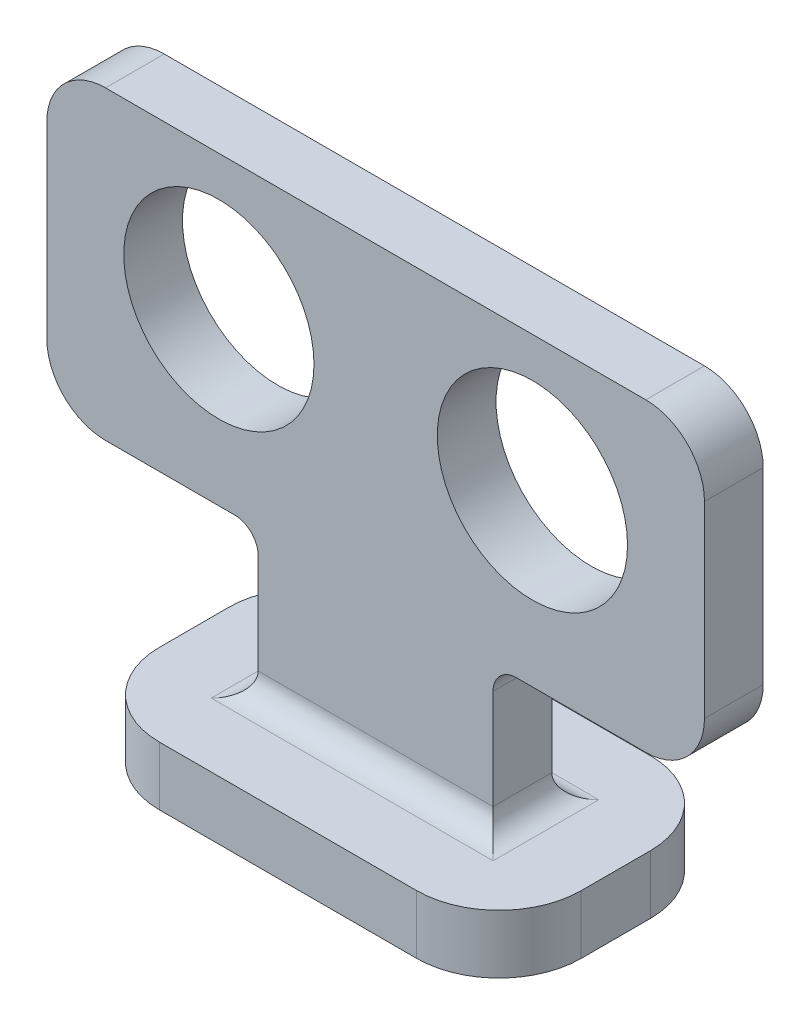
ISO-10303-21;
HEADER;
FILE_DESCRIPTION(('STEP AP214'),'2;1');
FILE_NAME('part.step','',(''),(''),'','','');
FILE_SCHEMA(('AUTOMOTIVE_DESIGN { 1 0 10303 214 1 1 1 1 }'));
ENDSEC;
DATA;
#1=APPLICATION_CONTEXT('core data for automotive mechanical design processes');
#2=APPLICATION_PROTOCOL_DEFINITION('international standard','automotive_design',2000,#1);
#3=PRODUCT_CONTEXT('',#1,'mechanical');
#4=PRODUCT('Part','Part','',(#3));
#5=PRODUCT_RELATED_PRODUCT_CATEGORY('part','',(#4));
#6=PRODUCT_DEFINITION_FORMATION('','',#4);
#7=PRODUCT_DEFINITION_CONTEXT('part definition',#1,'design');
#8=PRODUCT_DEFINITION('design','',#6,#7);
#9=PRODUCT_DEFINITION_SHAPE('','',#8);
#10=(LENGTH_UNIT() NAMED_UNIT(*) SI_UNIT(.MILLI.,.METRE.));
#11=(NAMED_UNIT(*) PLANE_ANGLE_UNIT() SI_UNIT($,.RADIAN.));
#12=(NAMED_UNIT(*) SI_UNIT($,.STERADIAN.) SOLID_ANGLE_UNIT());
#13=UNCERTAINTY_MEASURE_WITH_UNIT(LENGTH_MEASURE(1.E-05),#10,'distance_accuracy_value','');
#14=(GEOMETRIC_REPRESENTATION_CONTEXT(3) GLOBAL_UNCERTAINTY_ASSIGNED_CONTEXT((#13)) GLOBAL_UNIT_ASSIGNED_CONTEXT((#10,
#11,#12)) REPRESENTATION_CONTEXT('',''));
#15=CARTESIAN_POINT('',(0.,0.,0.));
#16=DIRECTION('',(0.,0.,1.));
#17=DIRECTION('',(1.,0.,0.));
#18=AXIS2_PLACEMENT_3D('',#15,#16,#17);
#19=CARTESIAN_POINT('',(-3.,-3.,5.));
#20=DIRECTION('',(0.,1.,0.));
#21=DIRECTION('',(0.,0.,1.));
#22=AXIS2_PLACEMENT_3D('',#19,#20,#21);
#23=PLANE('',#22);
#24=DIRECTION('',(1.,0.,0.));
#25=VECTOR('',#24,1.);
#26=CARTESIAN_POINT('',(-3.,-3.,5.));
#27=LINE('',#26,#25);
#28=CARTESIAN_POINT('',(37.,-3.,5.));
#29=VERTEX_POINT('',#28);
#30=CARTESIAN_POINT('',(48.,-3.,5.));
#31=VERTEX_POINT('',#30);
#32=EDGE_CURVE('E509',#29,#31,#27,.T.);
#33=ORIENTED_EDGE('',*,*,#32,.F.);
#34=DIRECTION('',(0.,0.,1.));
#35=VECTOR('',#34,1.);
#36=CARTESIAN_POINT('',(37.,-3.,0.));
#37=LINE('',#36,#35);
#38=CARTESIAN_POINT('',(37.,-3.,0.));
#39=VERTEX_POINT('',#38);
#40=EDGE_CURVE('E321',#29,#39,#37,.F.);
#41=ORIENTED_EDGE('',*,*,#40,.T.);
#42=DIRECTION('',(1.,0.,0.));
#43=VECTOR('',#42,1.);
#44=CARTESIAN_POINT('',(-3.,-3.,0.));
#45=LINE('',#44,#43);
#46=CARTESIAN_POINT('',(48.,-3.,0.));
#47=VERTEX_POINT('',#46);
#48=EDGE_CURVE('E480',#39,#47,#45,.T.);
#49=ORIENTED_EDGE('',*,*,#48,.T.);
#50=DIRECTION('',(0.,0.,-1.));
#51=VECTOR('',#50,1.);
#52=CARTESIAN_POINT('',(48.,-3.,5.));
#53=LINE('',#52,#51);
#54=EDGE_CURVE('E285',#47,#31,#53,.F.);
#55=ORIENTED_EDGE('',*,*,#54,.T.);
#56=EDGE_LOOP('',(#33,#41,#49,#55));
#57=FACE_BOUND('',#56,.T.);
#58=ADVANCED_FACE('F69',(#57),#23,.F.);
#59=CARTESIAN_POINT('',(2.,-3.,0.));
#60=VERTEX_POINT('',#59);
#61=CARTESIAN_POINT('',(13.,-3.,0.));
#62=VERTEX_POINT('',#61);
#63=EDGE_CURVE('E276',#60,#62,#45,.T.);
#64=ORIENTED_EDGE('',*,*,#63,.T.);
#65=DIRECTION('',(0.,0.,-1.));
#66=VECTOR('',#65,1.);
#67=CARTESIAN_POINT('',(13.,-3.,5.));
#68=LINE('',#67,#66);
#69=CARTESIAN_POINT('',(13.,-3.,5.));
#70=VERTEX_POINT('',#69);
#71=EDGE_CURVE('E328',#62,#70,#68,.F.);
#72=ORIENTED_EDGE('',*,*,#71,.T.);
#73=CARTESIAN_POINT('',(2.,-3.,5.));
#74=VERTEX_POINT('',#73);
#75=EDGE_CURVE('E498',#74,#70,#27,.T.);
#76=ORIENTED_EDGE('',*,*,#75,.F.);
#77=DIRECTION('',(0.,0.,-1.));
#78=VECTOR('',#77,1.);
#79=CARTESIAN_POINT('',(2.,-3.,5.));
#80=LINE('',#79,#78);
#81=EDGE_CURVE('E313',#74,#60,#80,.T.);
#82=ORIENTED_EDGE('',*,*,#81,.T.);
#83=EDGE_LOOP('',(#64,#72,#76,#82));
#84=FACE_BOUND('',#83,.T.);
#85=ADVANCED_FACE('F549',(#84),#23,.F.);
#86=CARTESIAN_POINT('',(0.,23.,5.));
#87=DIRECTION('',(0.,1.,0.));
#88=DIRECTION('',(-1.,0.,0.));
#89=AXIS2_PLACEMENT_3D('',#86,#87,#88);
#90=PLANE('',#89);
#91=DIRECTION('',(1.,0.,0.));
#92=VECTOR('',#91,1.);
#93=CARTESIAN_POINT('',(0.,23.,5.));
#94=LINE('',#93,#92);
#95=CARTESIAN_POINT('',(2.,23.,5.));
#96=VERTEX_POINT('',#95);
#97=CARTESIAN_POINT('',(48.,23.,5.));
#98=VERTEX_POINT('',#97);
#99=EDGE_CURVE('E481',#96,#98,#94,.T.);
#100=ORIENTED_EDGE('',*,*,#99,.T.);
#101=DIRECTION('',(0.,0.,-1.));
#102=VECTOR('',#101,1.);
#103=CARTESIAN_POINT('',(48.,23.,5.));
#104=LINE('',#103,#102);
#105=CARTESIAN_POINT('',(48.,23.,0.));
#106=VERTEX_POINT('',#105);
#107=EDGE_CURVE('E303',#98,#106,#104,.T.);
#108=ORIENTED_EDGE('',*,*,#107,.T.);
#109=DIRECTION('',(1.,0.,0.));
#110=VECTOR('',#109,1.);
#111=CARTESIAN_POINT('',(0.,23.,0.));
#112=LINE('',#111,#110);
#113=CARTESIAN_POINT('',(2.,23.,0.));
#114=VERTEX_POINT('',#113);
#115=EDGE_CURVE('E241',#114,#106,#112,.T.);
#116=ORIENTED_EDGE('',*,*,#115,.F.);
#117=DIRECTION('',(0.,0.,-1.));
#118=VECTOR('',#117,1.);
#119=CARTESIAN_POINT('',(2.,23.,5.));
#120=LINE('',#119,#118);
#121=EDGE_CURVE('E300',#114,#96,#120,.F.);
#122=ORIENTED_EDGE('',*,*,#121,.T.);
#123=EDGE_LOOP('',(#100,#108,#116,#122));
#124=FACE_BOUND('',#123,.T.);
#125=ADVANCED_FACE('F535',(#124),#90,.T.);
#126=CARTESIAN_POINT('',(-3.,0.,5.));
#127=DIRECTION('',(1.,0.,0.));
#128=DIRECTION('',(0.,0.,-1.));
#129=AXIS2_PLACEMENT_3D('',#126,#127,#128);
#130=PLANE('',#129);
#131=DIRECTION('',(0.,-1.,0.));
#132=VECTOR('',#131,1.);
#133=CARTESIAN_POINT('',(-3.,0.,5.));
#134=LINE('',#133,#132);
#135=CARTESIAN_POINT('',(-3.,18.,5.));
#136=VERTEX_POINT('',#135);
#137=CARTESIAN_POINT('',(-3.,2.,5.));
#138=VERTEX_POINT('',#137);
#139=EDGE_CURVE('E485',#136,#138,#134,.T.);
#140=ORIENTED_EDGE('',*,*,#139,.F.);
#141=DIRECTION('',(0.,0.,-1.));
#142=VECTOR('',#141,1.);
#143=CARTESIAN_POINT('',(-3.,18.,0.));
#144=LINE('',#143,#142);
#145=CARTESIAN_POINT('',(-3.,18.,0.));
#146=VERTEX_POINT('',#145);
#147=EDGE_CURVE('E309',#136,#146,#144,.T.);
#148=ORIENTED_EDGE('',*,*,#147,.T.);
#149=DIRECTION('',(0.,-1.,0.));
#150=VECTOR('',#149,1.);
#151=CARTESIAN_POINT('',(-3.,0.,0.));
#152=LINE('',#151,#150);
#153=CARTESIAN_POINT('',(-3.,2.,0.));
#154=VERTEX_POINT('',#153);
#155=EDGE_CURVE('E260',#146,#154,#152,.T.);
#156=ORIENTED_EDGE('',*,*,#155,.T.);
#157=DIRECTION('',(0.,0.,-1.));
#158=VECTOR('',#157,1.);
#159=CARTESIAN_POINT('',(-3.,2.,5.));
#160=LINE('',#159,#158);
#161=EDGE_CURVE('E306',#154,#138,#160,.F.);
#162=ORIENTED_EDGE('',*,*,#161,.T.);
#163=EDGE_LOOP('',(#140,#148,#156,#162));
#164=FACE_BOUND('',#163,.T.);
#165=ADVANCED_FACE('F543',(#164),#130,.F.);
#166=CARTESIAN_POINT('',(11.65,11.5,5.));
#167=DIRECTION('',(0.,0.,-1.));
#168=DIRECTION('',(-1.,0.,0.));
#169=AXIS2_PLACEMENT_3D('',#166,#167,#168);
#170=CYLINDRICAL_SURFACE('',#169,8.1);
#171=CARTESIAN_POINT('',(11.65,11.5,5.));
#172=DIRECTION('',(0.,0.,1.));
#173=DIRECTION('',(1.,0.,0.));
#174=AXIS2_PLACEMENT_3D('',#171,#172,#173);
#175=CIRCLE('',#174,8.1);
#176=CARTESIAN_POINT('',(19.75,11.5,5.));
#177=VERTEX_POINT('',#176);
#178=EDGE_CURVE('E273',#177,#177,#175,.T.);
#179=ORIENTED_EDGE('',*,*,#178,.T.);
#180=EDGE_LOOP('',(#179));
#181=FACE_BOUND('',#180,.T.);
#182=CARTESIAN_POINT('',(11.65,11.5,0.));
#183=DIRECTION('',(0.,0.,1.));
#184=DIRECTION('',(1.,0.,0.));
#185=AXIS2_PLACEMENT_3D('',#182,#183,#184);
#186=CIRCLE('',#185,8.1);
#187=CARTESIAN_POINT('',(19.75,11.5,0.));
#188=VERTEX_POINT('',#187);
#189=EDGE_CURVE('E259',#188,#188,#186,.T.);
#190=ORIENTED_EDGE('',*,*,#189,.F.);
#191=EDGE_LOOP('',(#190));
#192=FACE_BOUND('',#191,.T.);
#193=ADVANCED_FACE('F857',(#181,#192),#170,.F.);
#194=CARTESIAN_POINT('',(53.,0.,5.));
#195=DIRECTION('',(1.,0.,0.));
#196=DIRECTION('',(0.,0.,-1.));
#197=AXIS2_PLACEMENT_3D('',#194,#195,#196);
#198=PLANE('',#197);
#199=DIRECTION('',(0.,-1.,0.));
#200=VECTOR('',#199,1.);
#201=CARTESIAN_POINT('',(53.,0.,5.));
#202=LINE('',#201,#200);
#203=CARTESIAN_POINT('',(53.,18.,5.));
#204=VERTEX_POINT('',#203);
#205=CARTESIAN_POINT('',(53.,2.,5.));
#206=VERTEX_POINT('',#205);
#207=EDGE_CURVE('E490',#204,#206,#202,.T.);
#208=ORIENTED_EDGE('',*,*,#207,.T.);
#209=DIRECTION('',(0.,0.,-1.));
#210=VECTOR('',#209,1.);
#211=CARTESIAN_POINT('',(53.,2.,0.));
#212=LINE('',#211,#210);
#213=CARTESIAN_POINT('',(53.,2.,0.));
#214=VERTEX_POINT('',#213);
#215=EDGE_CURVE('E257',#206,#214,#212,.T.);
#216=ORIENTED_EDGE('',*,*,#215,.T.);
#217=DIRECTION('',(0.,-1.,0.));
#218=VECTOR('',#217,1.);
#219=CARTESIAN_POINT('',(53.,0.,0.));
#220=LINE('',#219,#218);
#221=CARTESIAN_POINT('',(53.,18.,0.));
#222=VERTEX_POINT('',#221);
#223=EDGE_CURVE('E239',#222,#214,#220,.T.);
#224=ORIENTED_EDGE('',*,*,#223,.F.);
#225=DIRECTION('',(0.,0.,-1.));
#226=VECTOR('',#225,1.);
#227=CARTESIAN_POINT('',(53.,18.,5.));
#228=LINE('',#227,#226);
#229=EDGE_CURVE('E254',#222,#204,#228,.F.);
#230=ORIENTED_EDGE('',*,*,#229,.T.);
#231=EDGE_LOOP('',(#208,#216,#224,#230));
#232=FACE_BOUND('',#231,.T.);
#233=ADVANCED_FACE('F253',(#232),#198,.T.);
#234=CARTESIAN_POINT('',(38.35,11.5,5.));
#235=DIRECTION('',(0.,0.,-1.));
#236=DIRECTION('',(-1.,0.,0.));
#237=AXIS2_PLACEMENT_3D('',#234,#235,#236);
#238=CYLINDRICAL_SURFACE('',#237,8.1);
#239=CARTESIAN_POINT('',(38.35,11.5,5.));
#240=DIRECTION('',(0.,0.,1.));
#241=DIRECTION('',(1.,0.,0.));
#242=AXIS2_PLACEMENT_3D('',#239,#240,#241);
#243=CIRCLE('',#242,8.1);
#244=CARTESIAN_POINT('',(46.45,11.5,5.));
#245=VERTEX_POINT('',#244);
#246=EDGE_CURVE('E266',#245,#245,#243,.T.);
#247=ORIENTED_EDGE('',*,*,#246,.T.);
#248=EDGE_LOOP('',(#247));
#249=FACE_BOUND('',#248,.T.);
#250=CARTESIAN_POINT('',(38.35,11.5,0.));
#251=DIRECTION('',(0.,0.,1.));
#252=DIRECTION('',(1.,0.,0.));
#253=AXIS2_PLACEMENT_3D('',#250,#251,#252);
#254=CIRCLE('',#253,8.1);
#255=CARTESIAN_POINT('',(46.45,11.5,0.));
#256=VERTEX_POINT('',#255);
#257=EDGE_CURVE('E486',#256,#256,#254,.T.);
#258=ORIENTED_EDGE('',*,*,#257,.F.);
#259=EDGE_LOOP('',(#258));
#260=FACE_BOUND('',#259,.T.);
#261=ADVANCED_FACE('F651',(#249,#260),#238,.F.);
#262=CARTESIAN_POINT('',(0.,0.,5.));
#263=DIRECTION('',(0.,0.,1.));
#264=DIRECTION('',(1.,0.,0.));
#265=AXIS2_PLACEMENT_3D('',#262,#263,#264);
#266=PLANE('',#265);
#267=DIRECTION('',(0.,1.,0.));
#268=VECTOR('',#267,1.);
#269=CARTESIAN_POINT('',(15.,-15.5,5.));
#270=LINE('',#269,#268);
#271=CARTESIAN_POINT('',(15.,-13.5,5.));
#272=VERTEX_POINT('',#271);
#273=CARTESIAN_POINT('',(15.,-5.,5.));
#274=VERTEX_POINT('',#273);
#275=EDGE_CURVE('E474',#272,#274,#270,.T.);
#276=ORIENTED_EDGE('',*,*,#275,.F.);
#277=DIRECTION('',(-1.,0.,0.));
#278=VECTOR('',#277,1.);
#279=CARTESIAN_POINT('',(35.,-13.5,5.));
#280=LINE('',#279,#278);
#281=CARTESIAN_POINT('',(35.,-13.5,5.));
#282=VERTEX_POINT('',#281);
#283=EDGE_CURVE('E362',#272,#282,#280,.F.);
#284=ORIENTED_EDGE('',*,*,#283,.T.);
#285=DIRECTION('',(0.,1.,0.));
#286=VECTOR('',#285,1.);
#287=CARTESIAN_POINT('',(35.,-15.5,5.));
#288=LINE('',#287,#286);
#289=CARTESIAN_POINT('',(35.,-5.,5.));
#290=VERTEX_POINT('',#289);
#291=EDGE_CURVE('E477',#282,#290,#288,.T.);
#292=ORIENTED_EDGE('',*,*,#291,.T.);
#293=CARTESIAN_POINT('',(37.,-5.,5.));
#294=DIRECTION('',(0.,0.,1.));
#295=DIRECTION('',(1.,0.,0.));
#296=AXIS2_PLACEMENT_3D('',#293,#294,#295);
#297=CIRCLE('',#296,2.);
#298=EDGE_CURVE('E331',#290,#29,#297,.F.);
#299=ORIENTED_EDGE('',*,*,#298,.T.);
#300=ORIENTED_EDGE('',*,*,#32,.T.);
#301=CARTESIAN_POINT('',(48.,2.,5.));
#302=DIRECTION('',(0.,0.,1.));
#303=DIRECTION('',(1.,0.,0.));
#304=AXIS2_PLACEMENT_3D('',#301,#302,#303);
#305=CIRCLE('',#304,5.);
#306=EDGE_CURVE('E297',#31,#206,#305,.T.);
#307=ORIENTED_EDGE('',*,*,#306,.T.);
#308=ORIENTED_EDGE('',*,*,#207,.F.);
#309=CARTESIAN_POINT('',(48.,18.,5.));
#310=DIRECTION('',(0.,0.,1.));
#311=DIRECTION('',(1.,0.,0.));
#312=AXIS2_PLACEMENT_3D('',#309,#310,#311);
#313=CIRCLE('',#312,5.);
#314=EDGE_CURVE('E264',#204,#98,#313,.T.);
#315=ORIENTED_EDGE('',*,*,#314,.T.);
#316=ORIENTED_EDGE('',*,*,#99,.F.);
#317=CARTESIAN_POINT('',(2.,18.,5.));
#318=DIRECTION('',(0.,0.,1.));
#319=DIRECTION('',(1.,0.,0.));
#320=AXIS2_PLACEMENT_3D('',#317,#318,#319);
#321=CIRCLE('',#320,5.);
#322=EDGE_CURVE('E292',#96,#136,#321,.T.);
#323=ORIENTED_EDGE('',*,*,#322,.T.);
#324=ORIENTED_EDGE('',*,*,#139,.T.);
#325=CARTESIAN_POINT('',(2.,2.,5.));
#326=DIRECTION('',(0.,0.,1.));
#327=DIRECTION('',(1.,0.,0.));
#328=AXIS2_PLACEMENT_3D('',#325,#326,#327);
#329=CIRCLE('',#328,5.);
#330=EDGE_CURVE('E289',#138,#74,#329,.T.);
#331=ORIENTED_EDGE('',*,*,#330,.T.);
#332=ORIENTED_EDGE('',*,*,#75,.T.);
#333=CARTESIAN_POINT('',(13.,-5.,5.));
#334=DIRECTION('',(0.,0.,1.));
#335=DIRECTION('',(1.,0.,0.));
#336=AXIS2_PLACEMENT_3D('',#333,#334,#335);
#337=CIRCLE('',#336,2.);
#338=EDGE_CURVE('E341',#70,#274,#337,.F.);
#339=ORIENTED_EDGE('',*,*,#338,.T.);
#340=EDGE_LOOP('',(#276,#284,#292,#299,#300,#307,#308,#315,#316,#323,#324,#331,#332,#339));
#341=FACE_BOUND('',#340,.T.);
#342=ORIENTED_EDGE('',*,*,#178,.F.);
#343=EDGE_LOOP('',(#342));
#344=FACE_BOUND('',#343,.T.);
#345=ORIENTED_EDGE('',*,*,#246,.F.);
#346=EDGE_LOOP('',(#345));
#347=FACE_BOUND('',#346,.T.);
#348=ADVANCED_FACE('F530',(#341,#344,#347),#266,.T.);
#349=CARTESIAN_POINT('',(0.,0.,0.));
#350=DIRECTION('',(0.,0.,1.));
#351=DIRECTION('',(1.,0.,0.));
#352=AXIS2_PLACEMENT_3D('',#349,#350,#351);
#353=PLANE('',#352);
#354=DIRECTION('',(0.,1.,0.));
#355=VECTOR('',#354,1.);
#356=CARTESIAN_POINT('',(35.,-15.5,0.));
#357=LINE('',#356,#355);
#358=CARTESIAN_POINT('',(35.,-13.5,0.));
#359=VERTEX_POINT('',#358);
#360=CARTESIAN_POINT('',(35.,-5.,0.));
#361=VERTEX_POINT('',#360);
#362=EDGE_CURVE('E467',#359,#361,#357,.T.);
#363=ORIENTED_EDGE('',*,*,#362,.F.);
#364=DIRECTION('',(1.,0.,0.));
#365=VECTOR('',#364,1.);
#366=CARTESIAN_POINT('',(0.,-13.5,0.));
#367=LINE('',#366,#365);
#368=CARTESIAN_POINT('',(15.,-13.5,0.));
#369=VERTEX_POINT('',#368);
#370=EDGE_CURVE('E368',#359,#369,#367,.F.);
#371=ORIENTED_EDGE('',*,*,#370,.T.);
#372=DIRECTION('',(0.,1.,0.));
#373=VECTOR('',#372,1.);
#374=CARTESIAN_POINT('',(15.,-15.5,0.));
#375=LINE('',#374,#373);
#376=CARTESIAN_POINT('',(15.,-5.,0.));
#377=VERTEX_POINT('',#376);
#378=EDGE_CURVE('E470',#369,#377,#375,.T.);
#379=ORIENTED_EDGE('',*,*,#378,.T.);
#380=CARTESIAN_POINT('',(13.,-5.,0.));
#381=DIRECTION('',(0.,0.,1.));
#382=DIRECTION('',(1.,0.,0.));
#383=AXIS2_PLACEMENT_3D('',#380,#381,#382);
#384=CIRCLE('',#383,2.);
#385=EDGE_CURVE('E338',#377,#62,#384,.T.);
#386=ORIENTED_EDGE('',*,*,#385,.T.);
#387=ORIENTED_EDGE('',*,*,#63,.F.);
#388=CARTESIAN_POINT('',(2.,2.,0.));
#389=DIRECTION('',(0.,0.,1.));
#390=DIRECTION('',(1.,0.,0.));
#391=AXIS2_PLACEMENT_3D('',#388,#389,#390);
#392=CIRCLE('',#391,5.);
#393=EDGE_CURVE('E270',#60,#154,#392,.F.);
#394=ORIENTED_EDGE('',*,*,#393,.T.);
#395=ORIENTED_EDGE('',*,*,#155,.F.);
#396=CARTESIAN_POINT('',(2.,18.,0.));
#397=DIRECTION('',(0.,0.,1.));
#398=DIRECTION('',(1.,0.,0.));
#399=AXIS2_PLACEMENT_3D('',#396,#397,#398);
#400=CIRCLE('',#399,5.);
#401=EDGE_CURVE('E248',#146,#114,#400,.F.);
#402=ORIENTED_EDGE('',*,*,#401,.T.);
#403=ORIENTED_EDGE('',*,*,#115,.T.);
#404=CARTESIAN_POINT('',(48.,18.,0.));
#405=DIRECTION('',(0.,0.,1.));
#406=DIRECTION('',(1.,0.,0.));
#407=AXIS2_PLACEMENT_3D('',#404,#405,#406);
#408=CIRCLE('',#407,5.);
#409=EDGE_CURVE('E233',#106,#222,#408,.F.);
#410=ORIENTED_EDGE('',*,*,#409,.T.);
#411=ORIENTED_EDGE('',*,*,#223,.T.);
#412=CARTESIAN_POINT('',(48.,2.,0.));
#413=DIRECTION('',(0.,0.,1.));
#414=DIRECTION('',(1.,0.,0.));
#415=AXIS2_PLACEMENT_3D('',#412,#413,#414);
#416=CIRCLE('',#415,5.);
#417=EDGE_CURVE('E247',#214,#47,#416,.F.);
#418=ORIENTED_EDGE('',*,*,#417,.T.);
#419=ORIENTED_EDGE('',*,*,#48,.F.);
#420=CARTESIAN_POINT('',(37.,-5.,0.));
#421=DIRECTION('',(0.,0.,1.));
#422=DIRECTION('',(1.,0.,0.));
#423=AXIS2_PLACEMENT_3D('',#420,#421,#422);
#424=CIRCLE('',#423,2.);
#425=EDGE_CURVE('E334',#39,#361,#424,.T.);
#426=ORIENTED_EDGE('',*,*,#425,.T.);
#427=EDGE_LOOP('',(#363,#371,#379,#386,#387,#394,#395,#402,#403,#410,#411,#418,#419,#426));
#428=FACE_BOUND('',#427,.T.);
#429=ORIENTED_EDGE('',*,*,#189,.T.);
#430=EDGE_LOOP('',(#429));
#431=FACE_BOUND('',#430,.T.);
#432=ORIENTED_EDGE('',*,*,#257,.T.);
#433=EDGE_LOOP('',(#432));
#434=FACE_BOUND('',#433,.T.);
#435=ADVANCED_FACE('F236',(#428,#431,#434),#353,.F.);
#436=CARTESIAN_POINT('',(35.,-15.5,0.));
#437=DIRECTION('',(-1.,0.,0.));
#438=DIRECTION('',(0.,0.,1.));
#439=AXIS2_PLACEMENT_3D('',#436,#437,#438);
#440=PLANE('',#439);
#441=ORIENTED_EDGE('',*,*,#291,.F.);
#442=DIRECTION('',(0.,0.,1.));
#443=VECTOR('',#442,1.);
#444=CARTESIAN_POINT('',(35.,-13.5,0.));
#445=LINE('',#444,#443);
#446=EDGE_CURVE('E365',#282,#359,#445,.F.);
#447=ORIENTED_EDGE('',*,*,#446,.T.);
#448=ORIENTED_EDGE('',*,*,#362,.T.);
#449=DIRECTION('',(0.,0.,1.));
#450=VECTOR('',#449,1.);
#451=CARTESIAN_POINT('',(35.,-5.,5.));
#452=LINE('',#451,#450);
#453=EDGE_CURVE('E317',#361,#290,#452,.T.);
#454=ORIENTED_EDGE('',*,*,#453,.T.);
#455=EDGE_LOOP('',(#441,#447,#448,#454));
#456=FACE_BOUND('',#455,.T.);
#457=ADVANCED_FACE('F580',(#456),#440,.F.);
#458=CARTESIAN_POINT('',(15.,-15.5,0.));
#459=DIRECTION('',(1.,0.,0.));
#460=DIRECTION('',(0.,0.,-1.));
#461=AXIS2_PLACEMENT_3D('',#458,#459,#460);
#462=PLANE('',#461);
#463=ORIENTED_EDGE('',*,*,#378,.F.);
#464=DIRECTION('',(0.,0.,-1.));
#465=VECTOR('',#464,1.);
#466=CARTESIAN_POINT('',(15.,-13.5,0.));
#467=LINE('',#466,#465);
#468=EDGE_CURVE('E358',#369,#272,#467,.F.);
#469=ORIENTED_EDGE('',*,*,#468,.T.);
#470=ORIENTED_EDGE('',*,*,#275,.T.);
#471=DIRECTION('',(0.,0.,-1.));
#472=VECTOR('',#471,1.);
#473=CARTESIAN_POINT('',(15.,-5.,0.));
#474=LINE('',#473,#472);
#475=EDGE_CURVE('E324',#274,#377,#474,.T.);
#476=ORIENTED_EDGE('',*,*,#475,.T.);
#477=EDGE_LOOP('',(#463,#469,#470,#476));
#478=FACE_BOUND('',#477,.T.);
#479=ADVANCED_FACE('F558',(#478),#462,.F.);
#480=CARTESIAN_POINT('',(42.95,-20.5,-7.45));
#481=DIRECTION('',(-1.,0.,0.));
#482=DIRECTION('',(0.,0.,1.));
#483=AXIS2_PLACEMENT_3D('',#480,#481,#482);
#484=PLANE('',#483);
#485=DIRECTION('',(0.,0.,1.));
#486=VECTOR('',#485,1.);
#487=CARTESIAN_POINT('',(42.95,-20.5,-7.45));
#488=LINE('',#487,#486);
#489=CARTESIAN_POINT('',(42.95,-20.5,-0.449999999999999));
#490=VERTEX_POINT('',#489);
#491=CARTESIAN_POINT('',(42.95,-20.5,5.45));
#492=VERTEX_POINT('',#491);
#493=EDGE_CURVE('E434',#490,#492,#488,.T.);
#494=ORIENTED_EDGE('',*,*,#493,.F.);
#495=DIRECTION('',(0.,1.,0.));
#496=VECTOR('',#495,1.);
#497=CARTESIAN_POINT('',(42.95,-20.5,-0.449999999999997));
#498=LINE('',#497,#496);
#499=CARTESIAN_POINT('',(42.95,-15.5,-0.449999999999999));
#500=VERTEX_POINT('',#499);
#501=EDGE_CURVE('E12',#490,#500,#498,.T.);
#502=ORIENTED_EDGE('',*,*,#501,.T.);
#503=DIRECTION('',(0.,0.,1.));
#504=VECTOR('',#503,1.);
#505=CARTESIAN_POINT('',(42.95,-15.5,-7.45));
#506=LINE('',#505,#504);
#507=CARTESIAN_POINT('',(42.95,-15.5,5.45));
#508=VERTEX_POINT('',#507);
#509=EDGE_CURVE('E386',#500,#508,#506,.T.);
#510=ORIENTED_EDGE('',*,*,#509,.T.);
#511=DIRECTION('',(0.,1.,0.));
#512=VECTOR('',#511,1.);
#513=CARTESIAN_POINT('',(42.95,-20.5,5.45));
#514=LINE('',#513,#512);
#515=EDGE_CURVE('E78',#508,#492,#514,.F.);
#516=ORIENTED_EDGE('',*,*,#515,.T.);
#517=EDGE_LOOP('',(#494,#502,#510,#516));
#518=FACE_BOUND('',#517,.T.);
#519=ADVANCED_FACE('F433',(#518),#484,.F.);
#520=CARTESIAN_POINT('',(7.05,-20.5,12.45));
#521=DIRECTION('',(0.,0.,-1.));
#522=DIRECTION('',(-1.,0.,0.));
#523=AXIS2_PLACEMENT_3D('',#520,#521,#522);
#524=PLANE('',#523);
#525=DIRECTION('',(-1.,0.,0.));
#526=VECTOR('',#525,1.);
#527=CARTESIAN_POINT('',(7.05,-15.5,12.45));
#528=LINE('',#527,#526);
#529=CARTESIAN_POINT('',(35.95,-15.5,12.45));
#530=VERTEX_POINT('',#529);
#531=CARTESIAN_POINT('',(14.05,-15.5,12.45));
#532=VERTEX_POINT('',#531);
#533=EDGE_CURVE('E449',#530,#532,#528,.T.);
#534=ORIENTED_EDGE('',*,*,#533,.T.);
#535=DIRECTION('',(0.,1.,0.));
#536=VECTOR('',#535,1.);
#537=CARTESIAN_POINT('',(14.05,-20.5,12.45));
#538=LINE('',#537,#536);
#539=CARTESIAN_POINT('',(14.05,-20.5,12.45));
#540=VERTEX_POINT('',#539);
#541=EDGE_CURVE('E85',#532,#540,#538,.F.);
#542=ORIENTED_EDGE('',*,*,#541,.T.);
#543=DIRECTION('',(-1.,0.,0.));
#544=VECTOR('',#543,1.);
#545=CARTESIAN_POINT('',(7.05,-20.5,12.45));
#546=LINE('',#545,#544);
#547=CARTESIAN_POINT('',(35.95,-20.5,12.45));
#548=VERTEX_POINT('',#547);
#549=EDGE_CURVE('E443',#548,#540,#546,.T.);
#550=ORIENTED_EDGE('',*,*,#549,.F.);
#551=DIRECTION('',(0.,1.,0.));
#552=VECTOR('',#551,1.);
#553=CARTESIAN_POINT('',(35.95,-20.5,12.45));
#554=LINE('',#553,#552);
#555=EDGE_CURVE('E423',#548,#530,#554,.T.);
#556=ORIENTED_EDGE('',*,*,#555,.T.);
#557=EDGE_LOOP('',(#534,#542,#550,#556));
#558=FACE_BOUND('',#557,.T.);
#559=ADVANCED_FACE('F448',(#558),#524,.F.);
#560=CARTESIAN_POINT('',(7.05,-20.5,-7.45));
#561=DIRECTION('',(1.,0.,0.));
#562=DIRECTION('',(0.,0.,-1.));
#563=AXIS2_PLACEMENT_3D('',#560,#561,#562);
#564=PLANE('',#563);
#565=DIRECTION('',(0.,0.,-1.));
#566=VECTOR('',#565,1.);
#567=CARTESIAN_POINT('',(7.05,-15.5,-7.45));
#568=LINE('',#567,#566);
#569=CARTESIAN_POINT('',(7.05,-15.5,5.45));
#570=VERTEX_POINT('',#569);
#571=CARTESIAN_POINT('',(7.05,-15.5,-0.449999999999999));
#572=VERTEX_POINT('',#571);
#573=EDGE_CURVE('E455',#570,#572,#568,.T.);
#574=ORIENTED_EDGE('',*,*,#573,.T.);
#575=DIRECTION('',(0.,1.,0.));
#576=VECTOR('',#575,1.);
#577=CARTESIAN_POINT('',(7.05,-20.5,-0.449999999999997));
#578=LINE('',#577,#576);
#579=CARTESIAN_POINT('',(7.05,-20.5,-0.449999999999999));
#580=VERTEX_POINT('',#579);
#581=EDGE_CURVE('E409',#572,#580,#578,.F.);
#582=ORIENTED_EDGE('',*,*,#581,.T.);
#583=DIRECTION('',(0.,0.,-1.));
#584=VECTOR('',#583,1.);
#585=CARTESIAN_POINT('',(7.05,-20.5,-7.45));
#586=LINE('',#585,#584);
#587=CARTESIAN_POINT('',(7.05,-20.5,5.45));
#588=VERTEX_POINT('',#587);
#589=EDGE_CURVE('E957',#588,#580,#586,.T.);
#590=ORIENTED_EDGE('',*,*,#589,.F.);
#591=DIRECTION('',(0.,1.,0.));
#592=VECTOR('',#591,1.);
#593=CARTESIAN_POINT('',(7.05,-20.5,5.45));
#594=LINE('',#593,#592);
#595=EDGE_CURVE('E405',#588,#570,#594,.T.);
#596=ORIENTED_EDGE('',*,*,#595,.T.);
#597=EDGE_LOOP('',(#574,#582,#590,#596));
#598=FACE_BOUND('',#597,.T.);
#599=ADVANCED_FACE('F734',(#598),#564,.F.);
#600=CARTESIAN_POINT('',(7.05,-20.5,-7.45));
#601=DIRECTION('',(0.,0.,1.));
#602=DIRECTION('',(1.,0.,0.));
#603=AXIS2_PLACEMENT_3D('',#600,#601,#602);
#604=PLANE('',#603);
#605=DIRECTION('',(1.,0.,0.));
#606=VECTOR('',#605,1.);
#607=CARTESIAN_POINT('',(7.05,-20.5,-7.45));
#608=LINE('',#607,#606);
#609=CARTESIAN_POINT('',(14.05,-20.5,-7.45));
#610=VERTEX_POINT('',#609);
#611=CARTESIAN_POINT('',(35.95,-20.5,-7.45));
#612=VERTEX_POINT('',#611);
#613=EDGE_CURVE('E471',#610,#612,#608,.T.);
#614=ORIENTED_EDGE('',*,*,#613,.F.);
#615=DIRECTION('',(0.,1.,0.));
#616=VECTOR('',#615,1.);
#617=CARTESIAN_POINT('',(14.05,-20.5,-7.45));
#618=LINE('',#617,#616);
#619=CARTESIAN_POINT('',(14.05,-15.5,-7.45));
#620=VERTEX_POINT('',#619);
#621=EDGE_CURVE('E389',#610,#620,#618,.T.);
#622=ORIENTED_EDGE('',*,*,#621,.T.);
#623=DIRECTION('',(1.,0.,0.));
#624=VECTOR('',#623,1.);
#625=CARTESIAN_POINT('',(7.05,-15.5,-7.45));
#626=LINE('',#625,#624);
#627=CARTESIAN_POINT('',(35.95,-15.5,-7.45));
#628=VERTEX_POINT('',#627);
#629=EDGE_CURVE('E444',#620,#628,#626,.T.);
#630=ORIENTED_EDGE('',*,*,#629,.T.);
#631=DIRECTION('',(0.,1.,0.));
#632=VECTOR('',#631,1.);
#633=CARTESIAN_POINT('',(35.95,-20.5,-7.45));
#634=LINE('',#633,#632);
#635=EDGE_CURVE('E371',#628,#612,#634,.F.);
#636=ORIENTED_EDGE('',*,*,#635,.T.);
#637=EDGE_LOOP('',(#614,#622,#630,#636));
#638=FACE_BOUND('',#637,.T.);
#639=ADVANCED_FACE('F744',(#638),#604,.F.);
#640=CARTESIAN_POINT('',(0.,-20.5,0.));
#641=DIRECTION('',(0.,1.,0.));
#642=DIRECTION('',(0.,0.,1.));
#643=AXIS2_PLACEMENT_3D('',#640,#641,#642);
#644=PLANE('',#643);
#645=ORIENTED_EDGE('',*,*,#589,.T.);
#646=CARTESIAN_POINT('',(14.05,-20.5,-0.449999999999997));
#647=DIRECTION('',(0.,1.,0.));
#648=DIRECTION('',(0.,0.,1.));
#649=AXIS2_PLACEMENT_3D('',#646,#647,#648);
#650=CIRCLE('',#649,7.);
#651=EDGE_CURVE('E420',#580,#610,#650,.F.);
#652=ORIENTED_EDGE('',*,*,#651,.T.);
#653=ORIENTED_EDGE('',*,*,#613,.T.);
#654=CARTESIAN_POINT('',(35.95,-20.5,-0.449999999999997));
#655=DIRECTION('',(0.,1.,0.));
#656=DIRECTION('',(0.,0.,1.));
#657=AXIS2_PLACEMENT_3D('',#654,#655,#656);
#658=CIRCLE('',#657,7.);
#659=EDGE_CURVE('E414',#612,#490,#658,.F.);
#660=ORIENTED_EDGE('',*,*,#659,.T.);
#661=ORIENTED_EDGE('',*,*,#493,.T.);
#662=CARTESIAN_POINT('',(35.95,-20.5,5.45));
#663=DIRECTION('',(0.,1.,0.));
#664=DIRECTION('',(0.,0.,1.));
#665=AXIS2_PLACEMENT_3D('',#662,#663,#664);
#666=CIRCLE('',#665,7.);
#667=EDGE_CURVE('E92',#492,#548,#666,.F.);
#668=ORIENTED_EDGE('',*,*,#667,.T.);
#669=ORIENTED_EDGE('',*,*,#549,.T.);
#670=CARTESIAN_POINT('',(14.05,-20.5,5.45));
#671=DIRECTION('',(0.,1.,0.));
#672=DIRECTION('',(0.,0.,1.));
#673=AXIS2_PLACEMENT_3D('',#670,#671,#672);
#674=CIRCLE('',#673,7.);
#675=EDGE_CURVE('E417',#540,#588,#674,.F.);
#676=ORIENTED_EDGE('',*,*,#675,.T.);
#677=EDGE_LOOP('',(#645,#652,#653,#660,#661,#668,#669,#676));
#678=FACE_BOUND('',#677,.T.);
#679=ADVANCED_FACE('F439',(#678),#644,.F.);
#680=CARTESIAN_POINT('',(0.,-15.5,0.));
#681=DIRECTION('',(0.,1.,0.));
#682=DIRECTION('',(0.,0.,1.));
#683=AXIS2_PLACEMENT_3D('',#680,#681,#682);
#684=PLANE('',#683);
#685=DIRECTION('',(-1.,0.,0.));
#686=VECTOR('',#685,1.);
#687=CARTESIAN_POINT('',(15.,-15.5,7.));
#688=LINE('',#687,#686);
#689=CARTESIAN_POINT('',(37.,-15.5,7.));
#690=VERTEX_POINT('',#689);
#691=CARTESIAN_POINT('',(13.,-15.5,7.));
#692=VERTEX_POINT('',#691);
#693=EDGE_CURVE('E351',#690,#692,#688,.T.);
#694=ORIENTED_EDGE('',*,*,#693,.T.);
#695=DIRECTION('',(0.,0.,-1.));
#696=VECTOR('',#695,1.);
#697=CARTESIAN_POINT('',(13.,-15.5,0.));
#698=LINE('',#697,#696);
#699=CARTESIAN_POINT('',(13.,-15.5,-2.));
#700=VERTEX_POINT('',#699);
#701=EDGE_CURVE('E354',#692,#700,#698,.T.);
#702=ORIENTED_EDGE('',*,*,#701,.T.);
#703=DIRECTION('',(1.,0.,0.));
#704=VECTOR('',#703,1.);
#705=CARTESIAN_POINT('',(0.,-15.5,-2.));
#706=LINE('',#705,#704);
#707=CARTESIAN_POINT('',(37.,-15.5,-2.));
#708=VERTEX_POINT('',#707);
#709=EDGE_CURVE('E345',#700,#708,#706,.T.);
#710=ORIENTED_EDGE('',*,*,#709,.T.);
#711=DIRECTION('',(0.,0.,1.));
#712=VECTOR('',#711,1.);
#713=CARTESIAN_POINT('',(37.,-15.5,0.));
#714=LINE('',#713,#712);
#715=EDGE_CURVE('E348',#708,#690,#714,.T.);
#716=ORIENTED_EDGE('',*,*,#715,.T.);
#717=EDGE_LOOP('',(#694,#702,#710,#716));
#718=FACE_BOUND('',#717,.T.);
#719=ORIENTED_EDGE('',*,*,#629,.F.);
#720=CARTESIAN_POINT('',(14.05,-15.5,-0.449999999999997));
#721=DIRECTION('',(0.,1.,0.));
#722=DIRECTION('',(0.,0.,1.));
#723=AXIS2_PLACEMENT_3D('',#720,#721,#722);
#724=CIRCLE('',#723,7.);
#725=EDGE_CURVE('E402',#620,#572,#724,.T.);
#726=ORIENTED_EDGE('',*,*,#725,.T.);
#727=ORIENTED_EDGE('',*,*,#573,.F.);
#728=CARTESIAN_POINT('',(14.05,-15.5,5.45));
#729=DIRECTION('',(0.,1.,0.));
#730=DIRECTION('',(0.,0.,1.));
#731=AXIS2_PLACEMENT_3D('',#728,#729,#730);
#732=CIRCLE('',#731,7.);
#733=EDGE_CURVE('E399',#570,#532,#732,.T.);
#734=ORIENTED_EDGE('',*,*,#733,.T.);
#735=ORIENTED_EDGE('',*,*,#533,.F.);
#736=CARTESIAN_POINT('',(35.95,-15.5,5.45));
#737=DIRECTION('',(0.,1.,0.));
#738=DIRECTION('',(0.,0.,1.));
#739=AXIS2_PLACEMENT_3D('',#736,#737,#738);
#740=CIRCLE('',#739,7.);
#741=EDGE_CURVE('E393',#530,#508,#740,.T.);
#742=ORIENTED_EDGE('',*,*,#741,.T.);
#743=ORIENTED_EDGE('',*,*,#509,.F.);
#744=CARTESIAN_POINT('',(35.95,-15.5,-0.449999999999997));
#745=DIRECTION('',(0.,1.,0.));
#746=DIRECTION('',(0.,0.,1.));
#747=AXIS2_PLACEMENT_3D('',#744,#745,#746);
#748=CIRCLE('',#747,7.);
#749=EDGE_CURVE('E396',#500,#628,#748,.T.);
#750=ORIENTED_EDGE('',*,*,#749,.T.);
#751=EDGE_LOOP('',(#719,#726,#727,#734,#735,#742,#743,#750));
#752=FACE_BOUND('',#751,.T.);
#753=ADVANCED_FACE('F452',(#718,#752),#684,.T.);
#754=CARTESIAN_POINT('',(48.,2.,5.));
#755=DIRECTION('',(0.,0.,1.));
#756=DIRECTION('',(1.,0.,0.));
#757=AXIS2_PLACEMENT_3D('',#754,#755,#756);
#758=CYLINDRICAL_SURFACE('',#757,5.);
#759=ORIENTED_EDGE('',*,*,#306,.F.);
#760=ORIENTED_EDGE('',*,*,#54,.F.);
#761=ORIENTED_EDGE('',*,*,#417,.F.);
#762=ORIENTED_EDGE('',*,*,#215,.F.);
#763=EDGE_LOOP('',(#759,#760,#761,#762));
#764=FACE_BOUND('',#763,.T.);
#765=ADVANCED_FACE('F528',(#764),#758,.T.);
#766=CARTESIAN_POINT('',(48.,18.,5.));
#767=DIRECTION('',(0.,0.,-1.));
#768=DIRECTION('',(-1.,0.,0.));
#769=AXIS2_PLACEMENT_3D('',#766,#767,#768);
#770=CYLINDRICAL_SURFACE('',#769,5.);
#771=ORIENTED_EDGE('',*,*,#314,.F.);
#772=ORIENTED_EDGE('',*,*,#229,.F.);
#773=ORIENTED_EDGE('',*,*,#409,.F.);
#774=ORIENTED_EDGE('',*,*,#107,.F.);
#775=EDGE_LOOP('',(#771,#772,#773,#774));
#776=FACE_BOUND('',#775,.T.);
#777=ADVANCED_FACE('F263',(#776),#770,.T.);
#778=CARTESIAN_POINT('',(2.,18.,5.));
#779=DIRECTION('',(0.,0.,1.));
#780=DIRECTION('',(1.,0.,0.));
#781=AXIS2_PLACEMENT_3D('',#778,#779,#780);
#782=CYLINDRICAL_SURFACE('',#781,5.);
#783=ORIENTED_EDGE('',*,*,#322,.F.);
#784=ORIENTED_EDGE('',*,*,#121,.F.);
#785=ORIENTED_EDGE('',*,*,#401,.F.);
#786=ORIENTED_EDGE('',*,*,#147,.F.);
#787=EDGE_LOOP('',(#783,#784,#785,#786));
#788=FACE_BOUND('',#787,.T.);
#789=ADVANCED_FACE('F538',(#788),#782,.T.);
#790=CARTESIAN_POINT('',(2.,2.,5.));
#791=DIRECTION('',(0.,0.,-1.));
#792=DIRECTION('',(-1.,0.,0.));
#793=AXIS2_PLACEMENT_3D('',#790,#791,#792);
#794=CYLINDRICAL_SURFACE('',#793,5.);
#795=ORIENTED_EDGE('',*,*,#330,.F.);
#796=ORIENTED_EDGE('',*,*,#161,.F.);
#797=ORIENTED_EDGE('',*,*,#393,.F.);
#798=ORIENTED_EDGE('',*,*,#81,.F.);
#799=EDGE_LOOP('',(#795,#796,#797,#798));
#800=FACE_BOUND('',#799,.T.);
#801=ADVANCED_FACE('F547',(#800),#794,.T.);
#802=CARTESIAN_POINT('',(37.,-5.,0.));
#803=DIRECTION('',(0.,0.,-1.));
#804=DIRECTION('',(-1.,0.,0.));
#805=AXIS2_PLACEMENT_3D('',#802,#803,#804);
#806=CYLINDRICAL_SURFACE('',#805,2.);
#807=ORIENTED_EDGE('',*,*,#425,.F.);
#808=ORIENTED_EDGE('',*,*,#40,.F.);
#809=ORIENTED_EDGE('',*,*,#298,.F.);
#810=ORIENTED_EDGE('',*,*,#453,.F.);
#811=EDGE_LOOP('',(#807,#808,#809,#810));
#812=FACE_BOUND('',#811,.T.);
#813=ADVANCED_FACE('F584',(#812),#806,.F.);
#814=CARTESIAN_POINT('',(13.,-5.,0.));
#815=DIRECTION('',(0.,0.,1.));
#816=DIRECTION('',(1.,0.,0.));
#817=AXIS2_PLACEMENT_3D('',#814,#815,#816);
#818=CYLINDRICAL_SURFACE('',#817,2.);
#819=ORIENTED_EDGE('',*,*,#338,.F.);
#820=ORIENTED_EDGE('',*,*,#71,.F.);
#821=ORIENTED_EDGE('',*,*,#385,.F.);
#822=ORIENTED_EDGE('',*,*,#475,.F.);
#823=EDGE_LOOP('',(#819,#820,#821,#822));
#824=FACE_BOUND('',#823,.T.);
#825=ADVANCED_FACE('F552',(#824),#818,.F.);
#826=CARTESIAN_POINT('',(37.,-13.5,0.));
#827=DIRECTION('',(0.,0.,1.));
#828=DIRECTION('',(1.,0.,0.));
#829=AXIS2_PLACEMENT_3D('',#826,#827,#828);
#830=CYLINDRICAL_SURFACE('',#829,2.);
#831=CARTESIAN_POINT('',(37.,-13.5,-2.));
#832=DIRECTION('',(0.707106781186547,0.,0.707106781186547));
#833=DIRECTION('',(0.707106781186547,0.,-0.707106781186547));
#834=AXIS2_PLACEMENT_3D('',#831,#832,#833);
#835=ELLIPSE('',#834,2.82842712474619,2.);
#836=EDGE_CURVE('E378',#359,#708,#835,.T.);
#837=ORIENTED_EDGE('',*,*,#836,.F.);
#838=ORIENTED_EDGE('',*,*,#446,.F.);
#839=CARTESIAN_POINT('',(37.,-13.5,7.));
#840=DIRECTION('',(-0.707106781186547,0.,0.707106781186547));
#841=DIRECTION('',(0.707106781186547,0.,0.707106781186547));
#842=AXIS2_PLACEMENT_3D('',#839,#840,#841);
#843=ELLIPSE('',#842,2.82842712474619,2.);
#844=EDGE_CURVE('E382',#690,#282,#843,.F.);
#845=ORIENTED_EDGE('',*,*,#844,.F.);
#846=ORIENTED_EDGE('',*,*,#715,.F.);
#847=EDGE_LOOP('',(#837,#838,#845,#846));
#848=FACE_BOUND('',#847,.T.);
#849=ADVANCED_FACE('F578',(#848),#830,.F.);
#850=CARTESIAN_POINT('',(0.,-13.5,7.));
#851=DIRECTION('',(1.,0.,0.));
#852=DIRECTION('',(0.,0.,-1.));
#853=AXIS2_PLACEMENT_3D('',#850,#851,#852);
#854=CYLINDRICAL_SURFACE('',#853,2.);
#855=ORIENTED_EDGE('',*,*,#844,.T.);
#856=ORIENTED_EDGE('',*,*,#283,.F.);
#857=CARTESIAN_POINT('',(13.,-13.5,7.));
#858=DIRECTION('',(0.707106781186547,0.,0.707106781186547));
#859=DIRECTION('',(0.707106781186547,0.,-0.707106781186547));
#860=AXIS2_PLACEMENT_3D('',#857,#858,#859);
#861=ELLIPSE('',#860,2.82842712474619,2.);
#862=EDGE_CURVE('E375',#692,#272,#861,.T.);
#863=ORIENTED_EDGE('',*,*,#862,.F.);
#864=ORIENTED_EDGE('',*,*,#693,.F.);
#865=EDGE_LOOP('',(#855,#856,#863,#864));
#866=FACE_BOUND('',#865,.T.);
#867=ADVANCED_FACE('F575',(#866),#854,.F.);
#868=CARTESIAN_POINT('',(0.,-13.5,-2.));
#869=DIRECTION('',(1.,0.,0.));
#870=DIRECTION('',(0.,0.,-1.));
#871=AXIS2_PLACEMENT_3D('',#868,#869,#870);
#872=CYLINDRICAL_SURFACE('',#871,2.);
#873=ORIENTED_EDGE('',*,*,#836,.T.);
#874=ORIENTED_EDGE('',*,*,#709,.F.);
#875=CARTESIAN_POINT('',(13.,-13.5,-2.));
#876=DIRECTION('',(0.707106781186547,0.,-0.707106781186547));
#877=DIRECTION('',(0.707106781186547,0.,0.707106781186547));
#878=AXIS2_PLACEMENT_3D('',#875,#876,#877);
#879=ELLIPSE('',#878,2.82842712474619,2.);
#880=EDGE_CURVE('E372',#369,#700,#879,.T.);
#881=ORIENTED_EDGE('',*,*,#880,.F.);
#882=ORIENTED_EDGE('',*,*,#370,.F.);
#883=EDGE_LOOP('',(#873,#874,#881,#882));
#884=FACE_BOUND('',#883,.T.);
#885=ADVANCED_FACE('F568',(#884),#872,.F.);
#886=CARTESIAN_POINT('',(13.,-13.5,0.));
#887=DIRECTION('',(0.,0.,-1.));
#888=DIRECTION('',(-1.,0.,0.));
#889=AXIS2_PLACEMENT_3D('',#886,#887,#888);
#890=CYLINDRICAL_SURFACE('',#889,2.);
#891=ORIENTED_EDGE('',*,*,#862,.T.);
#892=ORIENTED_EDGE('',*,*,#468,.F.);
#893=ORIENTED_EDGE('',*,*,#880,.T.);
#894=ORIENTED_EDGE('',*,*,#701,.F.);
#895=EDGE_LOOP('',(#891,#892,#893,#894));
#896=FACE_BOUND('',#895,.T.);
#897=ADVANCED_FACE('F562',(#896),#890,.F.);
#898=CARTESIAN_POINT('',(14.05,-20.5,-0.449999999999997));
#899=DIRECTION('',(0.,1.,0.));
#900=DIRECTION('',(0.,0.,1.));
#901=AXIS2_PLACEMENT_3D('',#898,#899,#900);
#902=CYLINDRICAL_SURFACE('',#901,7.);
#903=ORIENTED_EDGE('',*,*,#651,.F.);
#904=ORIENTED_EDGE('',*,*,#581,.F.);
#905=ORIENTED_EDGE('',*,*,#725,.F.);
#906=ORIENTED_EDGE('',*,*,#621,.F.);
#907=EDGE_LOOP('',(#903,#904,#905,#906));
#908=FACE_BOUND('',#907,.T.);
#909=ADVANCED_FACE('F715',(#908),#902,.T.);
#910=CARTESIAN_POINT('',(14.05,-20.5,5.45));
#911=DIRECTION('',(0.,1.,0.));
#912=DIRECTION('',(0.,0.,1.));
#913=AXIS2_PLACEMENT_3D('',#910,#911,#912);
#914=CYLINDRICAL_SURFACE('',#913,7.);
#915=ORIENTED_EDGE('',*,*,#675,.F.);
#916=ORIENTED_EDGE('',*,*,#541,.F.);
#917=ORIENTED_EDGE('',*,*,#733,.F.);
#918=ORIENTED_EDGE('',*,*,#595,.F.);
#919=EDGE_LOOP('',(#915,#916,#917,#918));
#920=FACE_BOUND('',#919,.T.);
#921=ADVANCED_FACE('F782',(#920),#914,.T.);
#922=CARTESIAN_POINT('',(35.95,-20.5,-0.449999999999997));
#923=DIRECTION('',(0.,1.,0.));
#924=DIRECTION('',(0.,0.,1.));
#925=AXIS2_PLACEMENT_3D('',#922,#923,#924);
#926=CYLINDRICAL_SURFACE('',#925,7.);
#927=ORIENTED_EDGE('',*,*,#659,.F.);
#928=ORIENTED_EDGE('',*,*,#635,.F.);
#929=ORIENTED_EDGE('',*,*,#749,.F.);
#930=ORIENTED_EDGE('',*,*,#501,.F.);
#931=EDGE_LOOP('',(#927,#928,#929,#930));
#932=FACE_BOUND('',#931,.T.);
#933=ADVANCED_FACE('F793',(#932),#926,.T.);
#934=CARTESIAN_POINT('',(35.95,-20.5,5.45));
#935=DIRECTION('',(0.,1.,0.));
#936=DIRECTION('',(0.,0.,1.));
#937=AXIS2_PLACEMENT_3D('',#934,#935,#936);
#938=CYLINDRICAL_SURFACE('',#937,7.);
#939=ORIENTED_EDGE('',*,*,#667,.F.);
#940=ORIENTED_EDGE('',*,*,#515,.F.);
#941=ORIENTED_EDGE('',*,*,#741,.F.);
#942=ORIENTED_EDGE('',*,*,#555,.F.);
#943=EDGE_LOOP('',(#939,#940,#941,#942));
#944=FACE_BOUND('',#943,.T.);
#945=ADVANCED_FACE('F71',(#944),#938,.T.);
#946=CLOSED_SHELL('',(#58,#85,#125,#165,#193,#233,#261,#348,#435,#457,#479,#519,#559,#599,#639,
#679,#753,#765,#777,#789,#801,#813,#825,#849,#867,#885,#897,#909,#921,#933,#945));
#947=MANIFOLD_SOLID_BREP('B2',#946);
#948=ADVANCED_BREP_SHAPE_REPRESENTATION('',(#18,#947),#14);
#949=SHAPE_DEFINITION_REPRESENTATION(#9,#948);
ENDSEC;
END-ISO-10303-21;
